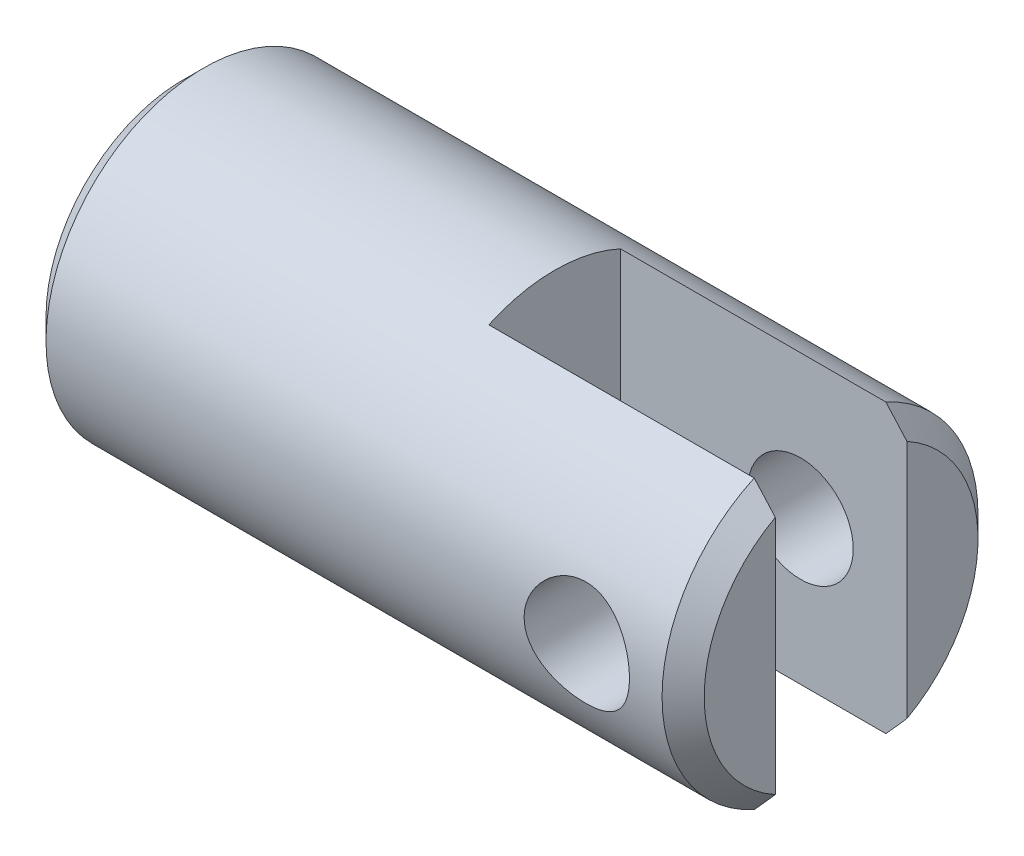
ISO-10303-21;
HEADER;
FILE_DESCRIPTION(('STEP AP214'),'2;1');
FILE_NAME('part.step','',(''),(''),'','','');
FILE_SCHEMA(('AUTOMOTIVE_DESIGN { 1 0 10303 214 1 1 1 1 }'));
ENDSEC;
DATA;
#1=APPLICATION_CONTEXT('core data for automotive mechanical design processes');
#2=APPLICATION_PROTOCOL_DEFINITION('international standard','automotive_design',2000,#1);
#3=PRODUCT_CONTEXT('',#1,'mechanical');
#4=PRODUCT('Part','Part','',(#3));
#5=PRODUCT_RELATED_PRODUCT_CATEGORY('part','',(#4));
#6=PRODUCT_DEFINITION_FORMATION('','',#4);
#7=PRODUCT_DEFINITION_CONTEXT('part definition',#1,'design');
#8=PRODUCT_DEFINITION('design','',#6,#7);
#9=PRODUCT_DEFINITION_SHAPE('','',#8);
#10=(LENGTH_UNIT() NAMED_UNIT(*) SI_UNIT(.MILLI.,.METRE.));
#11=(NAMED_UNIT(*) PLANE_ANGLE_UNIT() SI_UNIT($,.RADIAN.));
#12=(NAMED_UNIT(*) SI_UNIT($,.STERADIAN.) SOLID_ANGLE_UNIT());
#13=UNCERTAINTY_MEASURE_WITH_UNIT(LENGTH_MEASURE(1.E-05),#10,'distance_accuracy_value','');
#14=(GEOMETRIC_REPRESENTATION_CONTEXT(3) GLOBAL_UNCERTAINTY_ASSIGNED_CONTEXT((#13)) GLOBAL_UNIT_ASSIGNED_CONTEXT((#10,
#11,#12)) REPRESENTATION_CONTEXT('',''));
#15=CARTESIAN_POINT('',(0.,0.,0.));
#16=DIRECTION('',(0.,0.,1.));
#17=DIRECTION('',(1.,0.,0.));
#18=AXIS2_PLACEMENT_3D('',#15,#16,#17);
#19=CARTESIAN_POINT('',(39.6875,0.,0.));
#20=DIRECTION('',(1.,0.,0.));
#21=DIRECTION('',(0.,0.,-1.));
#22=AXIS2_PLACEMENT_3D('',#19,#20,#21);
#23=PLANE('',#22);
#24=DIRECTION('',(0.,1.,0.));
#25=VECTOR('',#24,1.);
#26=CARTESIAN_POINT('',(39.6875,-8.6587902409921,-3.96875));
#27=LINE('',#26,#25);
#28=CARTESIAN_POINT('',(39.6875,-7.238373328138,-3.96875));
#29=VERTEX_POINT('',#28);
#30=CARTESIAN_POINT('',(39.6875,7.238373328138,-3.96875));
#31=VERTEX_POINT('',#30);
#32=EDGE_CURVE('E114',#29,#31,#27,.T.);
#33=ORIENTED_EDGE('',*,*,#32,.F.);
#34=CARTESIAN_POINT('',(39.6875,0.,0.));
#35=DIRECTION('',(1.,0.,0.));
#36=DIRECTION('',(0.,0.,-1.));
#37=AXIS2_PLACEMENT_3D('',#34,#35,#36);
#38=CIRCLE('',#37,8.25499999999998);
#39=EDGE_CURVE('E212',#29,#31,#38,.T.);
#40=ORIENTED_EDGE('',*,*,#39,.T.);
#41=EDGE_LOOP('',(#33,#40));
#42=FACE_BOUND('',#41,.T.);
#43=ADVANCED_FACE('F34',(#42),#23,.T.);
#44=CARTESIAN_POINT('',(39.6875,0.,0.));
#45=DIRECTION('',(-1.,0.,0.));
#46=DIRECTION('',(0.,0.,1.));
#47=AXIS2_PLACEMENT_3D('',#44,#45,#46);
#48=CYLINDRICAL_SURFACE('',#47,9.525);
#49=CARTESIAN_POINT('',(1.27000000000001,0.,0.));
#50=DIRECTION('',(1.,0.,0.));
#51=DIRECTION('',(0.,0.,-1.));
#52=AXIS2_PLACEMENT_3D('',#49,#50,#51);
#53=CIRCLE('',#52,9.525);
#54=CARTESIAN_POINT('',(1.27000000000001,0.,-9.525));
#55=VERTEX_POINT('',#54);
#56=EDGE_CURVE('E134',#55,#55,#53,.T.);
#57=ORIENTED_EDGE('',*,*,#56,.T.);
#58=EDGE_LOOP('',(#57));
#59=FACE_BOUND('',#58,.T.);
#60=CARTESIAN_POINT('',(36.449,0.,-9.525));
#61=CARTESIAN_POINT('',(36.449000805598,0.173238677165346,-9.52500048580498));
#62=CARTESIAN_POINT('',(36.4347751550461,0.346472492659895,-9.52023018186455));
#63=CARTESIAN_POINT('',(36.3784225795053,0.687837590771685,-9.50167042395416));
#64=CARTESIAN_POINT('',(36.3362927579622,0.855968341777245,-9.48788003366834));
#65=CARTESIAN_POINT('',(36.2257364022556,1.18215660666814,-9.45277852602955));
#66=CARTESIAN_POINT('',(36.1573538266918,1.34023044718816,-9.43147998545459));
#67=CARTESIAN_POINT('',(35.9964317762382,1.6426654243569,-9.3835361515256));
#68=CARTESIAN_POINT('',(35.9038875361167,1.78702384834389,-9.35688980370195));
#69=CARTESIAN_POINT('',(35.6939030695735,2.06292981819569,-9.30002249856541));
#70=CARTESIAN_POINT('',(35.5757758312229,2.19393674844713,-9.26971591772517));
#71=CARTESIAN_POINT('',(35.3194392838066,2.43469379932912,-9.20941499436411));
#72=CARTESIAN_POINT('',(35.181225564102,2.54443923892904,-9.17942072197493));
#73=CARTESIAN_POINT('',(34.8837722592512,2.74264419157345,-9.12219830615344));
#74=CARTESIAN_POINT('',(34.7240423763505,2.83040092485178,-9.0950744970031));
#75=CARTESIAN_POINT('',(34.3910409000941,2.97757492456176,-9.04796594704059));
#76=CARTESIAN_POINT('',(34.2177734580083,3.03700083920298,-9.02797902810367));
#77=CARTESIAN_POINT('',(33.8687625217479,3.12379824029159,-8.99830887880273));
#78=CARTESIAN_POINT('',(33.6932993630472,3.15218269826286,-8.98830104068516));
#79=CARTESIAN_POINT('',(33.3398375805551,3.17925806658696,-8.97876209798686));
#80=CARTESIAN_POINT('',(33.1618397572483,3.17795815259498,-8.97922775597168));
#81=CARTESIAN_POINT('',(32.8170011983402,3.14648819425835,-8.99029872650972));
#82=CARTESIAN_POINT('',(32.6500223207321,3.1176401743052,-9.00043970379417));
#83=CARTESIAN_POINT('',(32.3234258927483,3.03404956704689,-9.02895888275449));
#84=CARTESIAN_POINT('',(32.1638092262436,2.97930387942919,-9.04733807064542));
#85=CARTESIAN_POINT('',(31.853464520047,2.84460650934116,-9.09059367841715));
#86=CARTESIAN_POINT('',(31.7029210191343,2.76426310464555,-9.11556996393148));
#87=CARTESIAN_POINT('',(31.4170348662119,2.58092291251246,-9.16916373477931));
#88=CARTESIAN_POINT('',(31.2816966219865,2.47791958175572,-9.19778227084722));
#89=CARTESIAN_POINT('',(31.0226341758395,2.2458341312661,-9.25726270107577));
#90=CARTESIAN_POINT('',(30.8998851949337,2.11567125149229,-9.28816371201626));
#91=CARTESIAN_POINT('',(30.6777032283437,1.83622813465495,-9.34742029378842));
#92=CARTESIAN_POINT('',(30.5782724788277,1.68694606622309,-9.37577562033364));
#93=CARTESIAN_POINT('',(30.4047642467537,1.3714336714219,-9.42711817702495));
#94=CARTESIAN_POINT('',(30.3309480649932,1.20504990262187,-9.45004936275525));
#95=CARTESIAN_POINT('',(30.2126549226906,0.861279339682312,-9.4875530068358));
#96=CARTESIAN_POINT('',(30.1681677705306,0.683896391141978,-9.50212836854242));
#97=CARTESIAN_POINT('',(30.111523260379,0.331418658755541,-9.52079715951823));
#98=CARTESIAN_POINT('',(30.0980481058765,0.156557979570887,-9.52531755822087));
#99=CARTESIAN_POINT('',(30.1000562386751,-0.192960847123753,-9.52464766056077));
#100=CARTESIAN_POINT('',(30.1155346379361,-0.367619023839889,-9.51945900331475));
#101=CARTESIAN_POINT('',(30.1739678070617,-0.706500575516011,-9.50023578476806));
#102=CARTESIAN_POINT('',(30.2161137042071,-0.870879661700629,-9.48646180908036));
#103=CARTESIAN_POINT('',(30.3256741861819,-1.19016766849015,-9.45171613685472));
#104=CARTESIAN_POINT('',(30.3930919933102,-1.34507537851482,-9.43074352248193));
#105=CARTESIAN_POINT('',(30.5532486210945,-1.64556534104864,-9.38304356837145));
#106=CARTESIAN_POINT('',(30.6466068336741,-1.79079512051444,-9.35617936849621));
#107=CARTESIAN_POINT('',(30.8552664262928,-2.06395583568048,-9.29974181184133));
#108=CARTESIAN_POINT('',(30.9705745079009,-2.19188146775095,-9.27016762910402));
#109=CARTESIAN_POINT('',(31.2260575344459,-2.432851712285,-9.20993992337912));
#110=CARTESIAN_POINT('',(31.3671242954928,-2.54495607735532,-9.17929841452584));
#111=CARTESIAN_POINT('',(31.6667247277996,-2.74401763337735,-9.121774152107));
#112=CARTESIAN_POINT('',(31.8252585446632,-2.83097461468096,-9.09489142987857));
#113=CARTESIAN_POINT('',(32.1553618235454,-2.97687025407194,-9.04819093937643));
#114=CARTESIAN_POINT('',(32.3269041013608,-3.03586556962394,-9.02835890517708));
#115=CARTESIAN_POINT('',(32.6783022138901,-3.12386556696095,-8.99829392572977));
#116=CARTESIAN_POINT('',(32.8581542651588,-3.15288375947876,-8.98805665630055));
#117=CARTESIAN_POINT('',(33.2111257799299,-3.17905219686556,-8.97883201925513));
#118=CARTESIAN_POINT('',(33.3841164304107,-3.17776306695416,-8.97929370817293));
#119=CARTESIAN_POINT('',(33.7272791128775,-3.1471942816996,-8.99005281690779));
#120=CARTESIAN_POINT('',(33.8974513120074,-3.11791629228101,-9.00034965132723));
#121=CARTESIAN_POINT('',(34.2269307300328,-3.03330550668567,-9.02920864668031));
#122=CARTESIAN_POINT('',(34.3863829193893,-2.97847812359925,-9.04761011221366));
#123=CARTESIAN_POINT('',(34.693947017029,-2.84473448628719,-9.09054566248638));
#124=CARTESIAN_POINT('',(34.8420563990219,-2.76581288515833,-9.11508110823773));
#125=CARTESIAN_POINT('',(35.1297356520052,-2.58210269895239,-9.16885482792697));
#126=CARTESIAN_POINT('',(35.2686508935274,-2.47633567077755,-9.19825159463785));
#127=CARTESIAN_POINT('',(35.5272651574948,-2.24359115395569,-9.25777156199328));
#128=CARTESIAN_POINT('',(35.6469587278096,-2.11660766813346,-9.28789496596782));
#129=CARTESIAN_POINT('',(35.8684335090181,-1.83909194322319,-9.34688346918603));
#130=CARTESIAN_POINT('',(35.9693348041094,-1.68783480536164,-9.3756537721899));
#131=CARTESIAN_POINT('',(36.1441696116008,-1.36955960976603,-9.42740021973043));
#132=CARTESIAN_POINT('',(36.2181100183025,-1.2025455950702,-9.45037784507677));
#133=CARTESIAN_POINT('',(36.3338161831515,-0.865167329863096,-9.4870751034262));
#134=CARTESIAN_POINT('',(36.3768718303862,-0.695286130622597,-9.50116249441509));
#135=CARTESIAN_POINT('',(36.4344593911499,-0.350267320832535,-9.52012342428904));
#136=CARTESIAN_POINT('',(36.4489991856015,-0.17513117618077,-9.52499950888798));
#137=CARTESIAN_POINT('',(36.449,0.,-9.525));
#138=B_SPLINE_CURVE_WITH_KNOTS('',3,(#60,#61,#62,#63,#64,#65,#66,#67,#68,#69,#70,#71,#72,#73,
#74,#75,#76,#77,#78,#79,#80,#81,#82,#83,#84,#85,#86,#87,#88,#89,#90,#91,#92,#93,#94,#95,#96,#97,
#98,#99,#100,#101,#102,#103,#104,#105,#106,#107,#108,#109,#110,#111,#112,#113,#114,#115,#116,
#117,#118,#119,#120,#121,#122,#123,#124,#125,#126,#127,#128,#129,#130,#131,#132,#133,#134,#135,
#136,#137),.UNSPECIFIED.,.T.,.F.,(4,2,2,2,2,2,2,2,2,2,2,2,2,2,2,2,2,2,2,2,2,2,2,2,2,2,2,2,2,2,2,
2,2,2,2,2,2,2,4),(0.,0.519071561632583,1.03819701322438,1.55645698636311,2.07481924951214,
2.6093637259775,3.14402575687909,3.69406121814519,4.24392866899746,4.77526114230341,
5.30642937910266,5.81332424300315,6.32027980466156,6.8353994341754,7.35066800622307,
7.89283745951089,8.43505888444012,8.98265937939884,9.53006948685135,10.0537512658116,
10.5773446429626,11.0857715158083,11.5942632377703,12.1161301950386,12.638156741095,
13.1839024764639,13.7296527614611,14.2742924389999,14.8186865394104,15.3351123975402,
15.8515075194062,16.3580948898032,16.8647947620873,17.3936046174648,17.92256420318,
18.4721392315144,19.0215736265905,19.5464607283686,20.0712027467109),.UNSPECIFIED.);
#139=CARTESIAN_POINT('',(36.449,0.,-9.525));
#140=VERTEX_POINT('',#139);
#141=EDGE_CURVE('E188',#140,#140,#138,.T.);
#142=ORIENTED_EDGE('',*,*,#141,.T.);
#143=EDGE_LOOP('',(#142));
#144=FACE_BOUND('',#143,.T.);
#145=CARTESIAN_POINT('',(36.449,0.,9.52499999999999));
#146=CARTESIAN_POINT('',(36.449000805598,-0.173238677165346,9.52500048580497));
#147=CARTESIAN_POINT('',(36.4347751550461,-0.346472492659896,9.52023018186455));
#148=CARTESIAN_POINT('',(36.3784225795053,-0.687837590771687,9.50167042395417));
#149=CARTESIAN_POINT('',(36.3362927579622,-0.855968341777246,9.48788003366834));
#150=CARTESIAN_POINT('',(36.2257364022556,-1.18215660666814,9.45277852602955));
#151=CARTESIAN_POINT('',(36.1573538266918,-1.34023044718816,9.43147998545459));
#152=CARTESIAN_POINT('',(35.9964317762382,-1.64266542435691,9.3835361515256));
#153=CARTESIAN_POINT('',(35.9038875361167,-1.78702384834389,9.35688980370195));
#154=CARTESIAN_POINT('',(35.6939030695735,-2.0629298181957,9.30002249856541));
#155=CARTESIAN_POINT('',(35.5757758312229,-2.19393674844713,9.26971591772517));
#156=CARTESIAN_POINT('',(35.3194392838066,-2.43469379932912,9.20941499436411));
#157=CARTESIAN_POINT('',(35.181225564102,-2.54443923892904,9.17942072197493));
#158=CARTESIAN_POINT('',(34.8837722592512,-2.74264419157345,9.12219830615344));
#159=CARTESIAN_POINT('',(34.7240423763505,-2.83040092485178,9.0950744970031));
#160=CARTESIAN_POINT('',(34.3910409000941,-2.97757492456176,9.04796594704059));
#161=CARTESIAN_POINT('',(34.2177734580083,-3.03700083920298,9.02797902810367));
#162=CARTESIAN_POINT('',(33.8687625217479,-3.12379824029159,8.99830887880273));
#163=CARTESIAN_POINT('',(33.6932993630472,-3.15218269826286,8.98830104068516));
#164=CARTESIAN_POINT('',(33.3398375805551,-3.17925806658696,8.97876209798686));
#165=CARTESIAN_POINT('',(33.1618397572483,-3.17795815259498,8.97922775597168));
#166=CARTESIAN_POINT('',(32.8170011983402,-3.14648819425835,8.99029872650972));
#167=CARTESIAN_POINT('',(32.6500223207321,-3.1176401743052,9.00043970379417));
#168=CARTESIAN_POINT('',(32.3234258927483,-3.03404956704689,9.02895888275449));
#169=CARTESIAN_POINT('',(32.1638092262436,-2.97930387942919,9.04733807064542));
#170=CARTESIAN_POINT('',(31.853464520047,-2.84460650934116,9.09059367841715));
#171=CARTESIAN_POINT('',(31.7029210191343,-2.76426310464555,9.11556996393148));
#172=CARTESIAN_POINT('',(31.4170348662119,-2.58092291251246,9.16916373477932));
#173=CARTESIAN_POINT('',(31.2816966219865,-2.47791958175571,9.19778227084722));
#174=CARTESIAN_POINT('',(31.0226341758395,-2.2458341312661,9.25726270107577));
#175=CARTESIAN_POINT('',(30.8998851949337,-2.11567125149229,9.28816371201626));
#176=CARTESIAN_POINT('',(30.6777032283437,-1.83622813465495,9.34742029378842));
#177=CARTESIAN_POINT('',(30.5782724788277,-1.68694606622308,9.37577562033364));
#178=CARTESIAN_POINT('',(30.4047642467537,-1.3714336714219,9.42711817702495));
#179=CARTESIAN_POINT('',(30.3309480649932,-1.20504990262187,9.45004936275525));
#180=CARTESIAN_POINT('',(30.2126549226906,-0.861279339682311,9.4875530068358));
#181=CARTESIAN_POINT('',(30.1681677705306,-0.683896391141977,9.50212836854242));
#182=CARTESIAN_POINT('',(30.111523260379,-0.331418658755539,9.52079715951823));
#183=CARTESIAN_POINT('',(30.0980481058765,-0.156557979570885,9.52531755822087));
#184=CARTESIAN_POINT('',(30.1000562386751,0.192960847123755,9.52464766056077));
#185=CARTESIAN_POINT('',(30.1155346379361,0.367619023839891,9.51945900331475));
#186=CARTESIAN_POINT('',(30.1739678070617,0.706500575516013,9.50023578476806));
#187=CARTESIAN_POINT('',(30.2161137042071,0.87087966170063,9.48646180908036));
#188=CARTESIAN_POINT('',(30.3256741861819,1.19016766849015,9.45171613685472));
#189=CARTESIAN_POINT('',(30.3930919933102,1.34507537851483,9.43074352248193));
#190=CARTESIAN_POINT('',(30.5532486210945,1.64556534104864,9.38304356837145));
#191=CARTESIAN_POINT('',(30.6466068336741,1.79079512051444,9.35617936849621));
#192=CARTESIAN_POINT('',(30.8552664262928,2.06395583568049,9.29974181184133));
#193=CARTESIAN_POINT('',(30.9705745079009,2.19188146775096,9.27016762910402));
#194=CARTESIAN_POINT('',(31.2260575344459,2.432851712285,9.20993992337912));
#195=CARTESIAN_POINT('',(31.3671242954928,2.54495607735532,9.17929841452584));
#196=CARTESIAN_POINT('',(31.6667247277996,2.74401763337735,9.121774152107));
#197=CARTESIAN_POINT('',(31.8252585446632,2.83097461468096,9.09489142987857));
#198=CARTESIAN_POINT('',(32.1553618235454,2.97687025407194,9.04819093937643));
#199=CARTESIAN_POINT('',(32.3269041013608,3.03586556962394,9.02835890517708));
#200=CARTESIAN_POINT('',(32.6783022138901,3.12386556696095,8.99829392572977));
#201=CARTESIAN_POINT('',(32.8581542651588,3.15288375947876,8.98805665630055));
#202=CARTESIAN_POINT('',(33.2111257799299,3.17905219686556,8.97883201925513));
#203=CARTESIAN_POINT('',(33.3841164304107,3.17776306695416,8.97929370817293));
#204=CARTESIAN_POINT('',(33.7272791128775,3.1471942816996,8.99005281690779));
#205=CARTESIAN_POINT('',(33.8974513120074,3.11791629228101,9.00034965132723));
#206=CARTESIAN_POINT('',(34.2269307300328,3.03330550668567,9.02920864668031));
#207=CARTESIAN_POINT('',(34.3863829193893,2.97847812359925,9.04761011221366));
#208=CARTESIAN_POINT('',(34.693947017029,2.84473448628719,9.09054566248638));
#209=CARTESIAN_POINT('',(34.8420563990219,2.76581288515833,9.11508110823773));
#210=CARTESIAN_POINT('',(35.1297356520052,2.58210269895239,9.16885482792697));
#211=CARTESIAN_POINT('',(35.2686508935274,2.47633567077754,9.19825159463785));
#212=CARTESIAN_POINT('',(35.5272651574948,2.24359115395568,9.25777156199328));
#213=CARTESIAN_POINT('',(35.6469587278096,2.11660766813345,9.28789496596782));
#214=CARTESIAN_POINT('',(35.8684335090181,1.83909194322319,9.34688346918603));
#215=CARTESIAN_POINT('',(35.9693348041094,1.68783480536164,9.3756537721899));
#216=CARTESIAN_POINT('',(36.1441696116008,1.36955960976603,9.42740021973043));
#217=CARTESIAN_POINT('',(36.2181100183025,1.2025455950702,9.45037784507677));
#218=CARTESIAN_POINT('',(36.3338161831515,0.865167329863095,9.48707510342621));
#219=CARTESIAN_POINT('',(36.3768718303862,0.695286130622595,9.5011624944151));
#220=CARTESIAN_POINT('',(36.4344593911499,0.350267320832533,9.52012342428904));
#221=CARTESIAN_POINT('',(36.4489991856015,0.175131176180769,9.52499950888797));
#222=CARTESIAN_POINT('',(36.449,0.,9.52499999999999));
#223=B_SPLINE_CURVE_WITH_KNOTS('',3,(#145,#146,#147,#148,#149,#150,#151,#152,#153,#154,#155,
#156,#157,#158,#159,#160,#161,#162,#163,#164,#165,#166,#167,#168,#169,#170,#171,#172,#173,#174,
#175,#176,#177,#178,#179,#180,#181,#182,#183,#184,#185,#186,#187,#188,#189,#190,#191,#192,#193,
#194,#195,#196,#197,#198,#199,#200,#201,#202,#203,#204,#205,#206,#207,#208,#209,#210,#211,#212,
#213,#214,#215,#216,#217,#218,#219,#220,#221,#222),.UNSPECIFIED.,.T.,.F.,(4,2,2,2,2,2,2,2,2,2,2,
2,2,2,2,2,2,2,2,2,2,2,2,2,2,2,2,2,2,2,2,2,2,2,2,2,2,2,4),(0.,0.519071561632585,1.03819701322438,
1.55645698636312,2.07481924951214,2.6093637259775,3.14402575687909,3.69406121814519,
4.24392866899746,4.77526114230341,5.30642937910266,5.81332424300315,6.32027980466156,
6.8353994341754,7.35066800622308,7.8928374595109,8.43505888444012,8.98265937939884,
9.53006948685135,10.0537512658116,10.5773446429626,11.0857715158083,11.5942632377703,
12.1161301950386,12.638156741095,13.1839024764639,13.7296527614611,14.2742924389999,
14.8186865394104,15.3351123975402,15.8515075194062,16.3580948898032,16.8647947620873,
17.3936046174648,17.92256420318,18.4721392315144,19.0215736265905,19.5464607283686,
20.0712027467109),.UNSPECIFIED.);
#224=CARTESIAN_POINT('',(36.449,0.,9.52499999999999));
#225=VERTEX_POINT('',#224);
#226=EDGE_CURVE('E181',#225,#225,#223,.T.);
#227=ORIENTED_EDGE('',*,*,#226,.T.);
#228=EDGE_LOOP('',(#227));
#229=FACE_BOUND('',#228,.T.);
#230=DIRECTION('',(1.,0.,0.));
#231=VECTOR('',#230,1.);
#232=CARTESIAN_POINT('',(22.4155,-8.6587902409921,3.96875));
#233=LINE('',#232,#231);
#234=CARTESIAN_POINT('',(22.4155,-8.6587902409921,3.96875));
#235=VERTEX_POINT('',#234);
#236=CARTESIAN_POINT('',(38.4175,-8.6587902409921,3.96875));
#237=VERTEX_POINT('',#236);
#238=EDGE_CURVE('E101',#235,#237,#233,.T.);
#239=ORIENTED_EDGE('',*,*,#238,.T.);
#240=CARTESIAN_POINT('',(38.4175,0.,0.));
#241=DIRECTION('',(1.,0.,0.));
#242=DIRECTION('',(0.,0.,-1.));
#243=AXIS2_PLACEMENT_3D('',#240,#241,#242);
#244=CIRCLE('',#243,9.525);
#245=CARTESIAN_POINT('',(38.4175,8.6587902409921,3.96875));
#246=VERTEX_POINT('',#245);
#247=EDGE_CURVE('E118',#237,#246,#244,.F.);
#248=ORIENTED_EDGE('',*,*,#247,.T.);
#249=DIRECTION('',(1.,0.,0.));
#250=VECTOR('',#249,1.);
#251=CARTESIAN_POINT('',(22.4155,8.6587902409921,3.96875));
#252=LINE('',#251,#250);
#253=CARTESIAN_POINT('',(22.4155,8.6587902409921,3.96875));
#254=VERTEX_POINT('',#253);
#255=EDGE_CURVE('E98',#254,#246,#252,.T.);
#256=ORIENTED_EDGE('',*,*,#255,.F.);
#257=CARTESIAN_POINT('',(22.4155,0.,0.));
#258=DIRECTION('',(1.,0.,0.));
#259=DIRECTION('',(0.,0.,-1.));
#260=AXIS2_PLACEMENT_3D('',#257,#258,#259);
#261=CIRCLE('',#260,9.525);
#262=CARTESIAN_POINT('',(22.4155,8.6587902409921,-3.96875));
#263=VERTEX_POINT('',#262);
#264=EDGE_CURVE('E105',#263,#254,#261,.T.);
#265=ORIENTED_EDGE('',*,*,#264,.F.);
#266=DIRECTION('',(1.,0.,0.));
#267=VECTOR('',#266,1.);
#268=CARTESIAN_POINT('',(22.4155,8.6587902409921,-3.96875));
#269=LINE('',#268,#267);
#270=CARTESIAN_POINT('',(38.4175,8.6587902409921,-3.96875));
#271=VERTEX_POINT('',#270);
#272=EDGE_CURVE('E132',#263,#271,#269,.T.);
#273=ORIENTED_EDGE('',*,*,#272,.T.);
#274=CARTESIAN_POINT('',(38.4175,0.,0.));
#275=DIRECTION('',(1.,0.,0.));
#276=DIRECTION('',(0.,0.,-1.));
#277=AXIS2_PLACEMENT_3D('',#274,#275,#276);
#278=CIRCLE('',#277,9.525);
#279=CARTESIAN_POINT('',(38.4175,-8.6587902409921,-3.96875));
#280=VERTEX_POINT('',#279);
#281=EDGE_CURVE('E130',#271,#280,#278,.F.);
#282=ORIENTED_EDGE('',*,*,#281,.T.);
#283=DIRECTION('',(1.,0.,0.));
#284=VECTOR('',#283,1.);
#285=CARTESIAN_POINT('',(22.4155,-8.6587902409921,-3.96875));
#286=LINE('',#285,#284);
#287=CARTESIAN_POINT('',(22.4155,-8.6587902409921,-3.96875));
#288=VERTEX_POINT('',#287);
#289=EDGE_CURVE('E120',#288,#280,#286,.T.);
#290=ORIENTED_EDGE('',*,*,#289,.F.);
#291=CARTESIAN_POINT('',(22.4155,0.,0.));
#292=DIRECTION('',(1.,0.,0.));
#293=DIRECTION('',(0.,0.,-1.));
#294=AXIS2_PLACEMENT_3D('',#291,#292,#293);
#295=CIRCLE('',#294,9.525);
#296=EDGE_CURVE('E104',#235,#288,#295,.T.);
#297=ORIENTED_EDGE('',*,*,#296,.F.);
#298=EDGE_LOOP('',(#239,#248,#256,#265,#273,#282,#290,#297));
#299=FACE_BOUND('',#298,.T.);
#300=ADVANCED_FACE('F116',(#59,#144,#229,#299),#48,.T.);
#301=DIRECTION('',(0.,-1.,0.));
#302=VECTOR('',#301,1.);
#303=CARTESIAN_POINT('',(39.6875,8.6587902409921,3.96875));
#304=LINE('',#303,#302);
#305=CARTESIAN_POINT('',(39.6875,7.238373328138,3.96875));
#306=VERTEX_POINT('',#305);
#307=CARTESIAN_POINT('',(39.6875,-7.238373328138,3.96875));
#308=VERTEX_POINT('',#307);
#309=EDGE_CURVE('E193',#306,#308,#304,.T.);
#310=ORIENTED_EDGE('',*,*,#309,.F.);
#311=CARTESIAN_POINT('',(39.6875,0.,0.));
#312=DIRECTION('',(1.,0.,0.));
#313=DIRECTION('',(0.,0.,-1.));
#314=AXIS2_PLACEMENT_3D('',#311,#312,#313);
#315=CIRCLE('',#314,8.25499999999998);
#316=EDGE_CURVE('E140',#306,#308,#315,.T.);
#317=ORIENTED_EDGE('',*,*,#316,.T.);
#318=EDGE_LOOP('',(#310,#317));
#319=FACE_BOUND('',#318,.T.);
#320=ADVANCED_FACE('F166',(#319),#23,.T.);
#321=CARTESIAN_POINT('',(0.,0.,0.));
#322=DIRECTION('',(1.,0.,0.));
#323=DIRECTION('',(0.,0.,-1.));
#324=AXIS2_PLACEMENT_3D('',#321,#322,#323);
#325=PLANE('',#324);
#326=CARTESIAN_POINT('',(0.,0.,0.));
#327=DIRECTION('',(-1.,0.,0.));
#328=DIRECTION('',(0.,0.,1.));
#329=AXIS2_PLACEMENT_3D('',#326,#327,#328);
#330=CIRCLE('',#329,3.175);
#331=CARTESIAN_POINT('',(0.,0.,3.175));
#332=VERTEX_POINT('',#331);
#333=EDGE_CURVE('E233',#332,#332,#330,.T.);
#334=ORIENTED_EDGE('',*,*,#333,.F.);
#335=EDGE_LOOP('',(#334));
#336=FACE_BOUND('',#335,.T.);
#337=CARTESIAN_POINT('',(0.,0.,0.));
#338=DIRECTION('',(1.,0.,0.));
#339=DIRECTION('',(0.,0.,-1.));
#340=AXIS2_PLACEMENT_3D('',#337,#338,#339);
#341=CIRCLE('',#340,8.25499999999998);
#342=CARTESIAN_POINT('',(0.,0.,-8.25499999999998));
#343=VERTEX_POINT('',#342);
#344=EDGE_CURVE('E137',#343,#343,#341,.F.);
#345=ORIENTED_EDGE('',*,*,#344,.T.);
#346=EDGE_LOOP('',(#345));
#347=FACE_BOUND('',#346,.T.);
#348=ADVANCED_FACE('F170',(#336,#347),#325,.F.);
#349=CARTESIAN_POINT('',(22.4155,-8.6587902409921,-3.96875));
#350=DIRECTION('',(0.,0.,-1.));
#351=DIRECTION('',(-1.,0.,0.));
#352=AXIS2_PLACEMENT_3D('',#349,#350,#351);
#353=PLANE('',#352);
#354=CARTESIAN_POINT('',(33.274,0.,-3.96875));
#355=DIRECTION('',(0.,0.,-1.));
#356=DIRECTION('',(-1.,0.,0.));
#357=AXIS2_PLACEMENT_3D('',#354,#355,#356);
#358=CIRCLE('',#357,3.175);
#359=CARTESIAN_POINT('',(30.099,0.,-3.96875));
#360=VERTEX_POINT('',#359);
#361=EDGE_CURVE('E128',#360,#360,#358,.T.);
#362=ORIENTED_EDGE('',*,*,#361,.T.);
#363=EDGE_LOOP('',(#362));
#364=FACE_BOUND('',#363,.T.);
#365=ORIENTED_EDGE('',*,*,#32,.T.);
#366=CARTESIAN_POINT('',(39.6875,7.238373328138,-3.96875));
#367=CARTESIAN_POINT('',(39.582811591401,7.35776096709702,-3.96875));
#368=CARTESIAN_POINT('',(39.4777893200169,7.47685515838941,-3.96875));
#369=CARTESIAN_POINT('',(39.2671521128822,7.71451414919927,-3.96875));
#370=CARTESIAN_POINT('',(39.1615371889559,7.83307895919474,-3.96875));
#371=CARTESIAN_POINT('',(38.9497859943266,8.06974095851595,-3.96875));
#372=CARTESIAN_POINT('',(38.8436497257174,8.18783814971643,-3.96875));
#373=CARTESIAN_POINT('',(38.6309102830091,8.42361556230968,-3.96875));
#374=CARTESIAN_POINT('',(38.5243070996771,8.54129577537304,-3.96875));
#375=CARTESIAN_POINT('',(38.4175,8.6587902409921,-3.96875));
#376=B_SPLINE_CURVE_WITH_KNOTS('',3,(#366,#367,#368,#369,#370,#371,#372,#373,#374,#375),
.UNSPECIFIED.,.F.,.F.,(4,2,2,2,4),(0.,0.476357362425002,0.952705254187973,1.42905123428182,
1.90540667664287),.UNSPECIFIED.);
#377=EDGE_CURVE('E11',#31,#271,#376,.T.);
#378=ORIENTED_EDGE('',*,*,#377,.T.);
#379=ORIENTED_EDGE('',*,*,#272,.F.);
#380=DIRECTION('',(0.,1.,0.));
#381=VECTOR('',#380,1.);
#382=CARTESIAN_POINT('',(22.4155,-8.6587902409921,-3.96875));
#383=LINE('',#382,#381);
#384=EDGE_CURVE('E111',#288,#263,#383,.T.);
#385=ORIENTED_EDGE('',*,*,#384,.F.);
#386=ORIENTED_EDGE('',*,*,#289,.T.);
#387=CARTESIAN_POINT('',(38.4175,-8.6587902409921,-3.96875));
#388=CARTESIAN_POINT('',(38.5243070996771,-8.54129577537304,-3.96875));
#389=CARTESIAN_POINT('',(38.6309102830091,-8.42361556230968,-3.96875));
#390=CARTESIAN_POINT('',(38.8436497257174,-8.18783814971643,-3.96875));
#391=CARTESIAN_POINT('',(38.9497859943266,-8.06974095851595,-3.96875));
#392=CARTESIAN_POINT('',(39.1615371889559,-7.83307895919474,-3.96875));
#393=CARTESIAN_POINT('',(39.2671521128822,-7.71451414919927,-3.96875));
#394=CARTESIAN_POINT('',(39.4777893200169,-7.47685515838941,-3.96875));
#395=CARTESIAN_POINT('',(39.582811591401,-7.35776096709702,-3.96875));
#396=CARTESIAN_POINT('',(39.6875,-7.23837332813801,-3.96875));
#397=B_SPLINE_CURVE_WITH_KNOTS('',3,(#387,#388,#389,#390,#391,#392,#393,#394,#395,#396),
.UNSPECIFIED.,.F.,.F.,(4,2,2,2,4),(0.,0.476355442361045,0.952701422454901,1.42904931421787,
1.90540667664288),.UNSPECIFIED.);
#398=EDGE_CURVE('E48',#280,#29,#397,.T.);
#399=ORIENTED_EDGE('',*,*,#398,.T.);
#400=EDGE_LOOP('',(#365,#378,#379,#385,#386,#399));
#401=FACE_BOUND('',#400,.T.);
#402=ADVANCED_FACE('F162',(#364,#401),#353,.F.);
#403=CARTESIAN_POINT('',(22.4155,8.6587902409921,3.96875));
#404=DIRECTION('',(0.,0.,1.));
#405=DIRECTION('',(1.,0.,0.));
#406=AXIS2_PLACEMENT_3D('',#403,#404,#405);
#407=PLANE('',#406);
#408=CARTESIAN_POINT('',(33.274,0.,3.96875));
#409=DIRECTION('',(0.,0.,1.));
#410=DIRECTION('',(1.,0.,0.));
#411=AXIS2_PLACEMENT_3D('',#408,#409,#410);
#412=CIRCLE('',#411,3.175);
#413=CARTESIAN_POINT('',(36.449,0.,3.96875));
#414=VERTEX_POINT('',#413);
#415=EDGE_CURVE('E125',#414,#414,#412,.T.);
#416=ORIENTED_EDGE('',*,*,#415,.T.);
#417=EDGE_LOOP('',(#416));
#418=FACE_BOUND('',#417,.T.);
#419=ORIENTED_EDGE('',*,*,#309,.T.);
#420=CARTESIAN_POINT('',(39.6875,-7.238373328138,3.96875));
#421=CARTESIAN_POINT('',(39.582811591401,-7.35776096709702,3.96875));
#422=CARTESIAN_POINT('',(39.4777893200169,-7.47685515838941,3.96875));
#423=CARTESIAN_POINT('',(39.2671521128822,-7.71451414919927,3.96875));
#424=CARTESIAN_POINT('',(39.1615371889559,-7.83307895919474,3.96875));
#425=CARTESIAN_POINT('',(38.9497859943266,-8.06974095851595,3.96875));
#426=CARTESIAN_POINT('',(38.8436497257174,-8.18783814971643,3.96875));
#427=CARTESIAN_POINT('',(38.6309102830091,-8.42361556230968,3.96875));
#428=CARTESIAN_POINT('',(38.5243070996771,-8.54129577537304,3.96875));
#429=CARTESIAN_POINT('',(38.4175,-8.6587902409921,3.96875));
#430=B_SPLINE_CURVE_WITH_KNOTS('',3,(#420,#421,#422,#423,#424,#425,#426,#427,#428,#429),
.UNSPECIFIED.,.F.,.F.,(4,2,2,2,4),(0.,0.476357362425002,0.952705254187973,1.42905123428182,
1.90540667664287),.UNSPECIFIED.);
#431=EDGE_CURVE('E150',#308,#237,#430,.T.);
#432=ORIENTED_EDGE('',*,*,#431,.T.);
#433=ORIENTED_EDGE('',*,*,#238,.F.);
#434=DIRECTION('',(0.,-1.,0.));
#435=VECTOR('',#434,1.);
#436=CARTESIAN_POINT('',(22.4155,8.6587902409921,3.96875));
#437=LINE('',#436,#435);
#438=EDGE_CURVE('E93',#254,#235,#437,.T.);
#439=ORIENTED_EDGE('',*,*,#438,.F.);
#440=ORIENTED_EDGE('',*,*,#255,.T.);
#441=CARTESIAN_POINT('',(38.4175,8.6587902409921,3.96875));
#442=CARTESIAN_POINT('',(38.5243070996771,8.54129577537304,3.96875));
#443=CARTESIAN_POINT('',(38.6309102830091,8.42361556230968,3.96875));
#444=CARTESIAN_POINT('',(38.8436497257174,8.18783814971643,3.96875));
#445=CARTESIAN_POINT('',(38.9497859943266,8.06974095851595,3.96875));
#446=CARTESIAN_POINT('',(39.1615371889559,7.83307895919474,3.96875));
#447=CARTESIAN_POINT('',(39.2671521128822,7.71451414919927,3.96875));
#448=CARTESIAN_POINT('',(39.4777893200169,7.47685515838941,3.96875));
#449=CARTESIAN_POINT('',(39.582811591401,7.35776096709702,3.96875));
#450=CARTESIAN_POINT('',(39.6875,7.23837332813801,3.96875));
#451=B_SPLINE_CURVE_WITH_KNOTS('',3,(#441,#442,#443,#444,#445,#446,#447,#448,#449,#450),
.UNSPECIFIED.,.F.,.F.,(4,2,2,2,4),(0.,0.476355442361045,0.952701422454901,1.42904931421787,
1.90540667664288),.UNSPECIFIED.);
#452=EDGE_CURVE('E143',#246,#306,#451,.T.);
#453=ORIENTED_EDGE('',*,*,#452,.T.);
#454=EDGE_LOOP('',(#419,#432,#433,#439,#440,#453));
#455=FACE_BOUND('',#454,.T.);
#456=ADVANCED_FACE('F96',(#418,#455),#407,.F.);
#457=CARTESIAN_POINT('',(22.4155,0.,0.));
#458=DIRECTION('',(1.,0.,0.));
#459=DIRECTION('',(0.,0.,-1.));
#460=AXIS2_PLACEMENT_3D('',#457,#458,#459);
#461=PLANE('',#460);
#462=ORIENTED_EDGE('',*,*,#264,.T.);
#463=ORIENTED_EDGE('',*,*,#438,.T.);
#464=ORIENTED_EDGE('',*,*,#296,.T.);
#465=ORIENTED_EDGE('',*,*,#384,.T.);
#466=EDGE_LOOP('',(#462,#463,#464,#465));
#467=FACE_BOUND('',#466,.T.);
#468=ADVANCED_FACE('F109',(#467),#461,.T.);
#469=CARTESIAN_POINT('',(33.274,0.,-9.525));
#470=DIRECTION('',(0.,0.,1.));
#471=DIRECTION('',(1.,0.,0.));
#472=AXIS2_PLACEMENT_3D('',#469,#470,#471);
#473=CYLINDRICAL_SURFACE('',#472,3.175);
#474=ORIENTED_EDGE('',*,*,#415,.F.);
#475=EDGE_LOOP('',(#474));
#476=FACE_BOUND('',#475,.T.);
#477=ORIENTED_EDGE('',*,*,#226,.F.);
#478=EDGE_LOOP('',(#477));
#479=FACE_BOUND('',#478,.T.);
#480=ADVANCED_FACE('F198',(#476,#479),#473,.F.);
#481=ORIENTED_EDGE('',*,*,#361,.F.);
#482=EDGE_LOOP('',(#481));
#483=FACE_BOUND('',#482,.T.);
#484=ORIENTED_EDGE('',*,*,#141,.F.);
#485=EDGE_LOOP('',(#484));
#486=FACE_BOUND('',#485,.T.);
#487=ADVANCED_FACE('F194',(#483,#486),#473,.F.);
#488=CARTESIAN_POINT('',(1.27000000000001,0.,0.));
#489=DIRECTION('',(1.,0.,0.));
#490=DIRECTION('',(0.,0.,-1.));
#491=AXIS2_PLACEMENT_3D('',#488,#489,#490);
#492=CONICAL_SURFACE('',#491,9.525,0.785398163397454);
#493=ORIENTED_EDGE('',*,*,#344,.F.);
#494=EDGE_LOOP('',(#493));
#495=FACE_BOUND('',#494,.T.);
#496=ORIENTED_EDGE('',*,*,#56,.F.);
#497=EDGE_LOOP('',(#496));
#498=FACE_BOUND('',#497,.T.);
#499=ADVANCED_FACE('F178',(#495,#498),#492,.T.);
#500=CARTESIAN_POINT('',(39.6875,0.,0.));
#501=DIRECTION('',(-1.,0.,0.));
#502=DIRECTION('',(0.,0.,1.));
#503=AXIS2_PLACEMENT_3D('',#500,#501,#502);
#504=CONICAL_SURFACE('',#503,8.25499999999998,0.785398163397454);
#505=ORIENTED_EDGE('',*,*,#452,.F.);
#506=ORIENTED_EDGE('',*,*,#247,.F.);
#507=ORIENTED_EDGE('',*,*,#431,.F.);
#508=ORIENTED_EDGE('',*,*,#316,.F.);
#509=EDGE_LOOP('',(#505,#506,#507,#508));
#510=FACE_BOUND('',#509,.T.);
#511=ADVANCED_FACE('F156',(#510),#504,.T.);
#512=CARTESIAN_POINT('',(39.6875,0.,0.));
#513=DIRECTION('',(-1.,0.,0.));
#514=DIRECTION('',(0.,0.,1.));
#515=AXIS2_PLACEMENT_3D('',#512,#513,#514);
#516=CONICAL_SURFACE('',#515,8.25499999999998,0.785398163397454);
#517=ORIENTED_EDGE('',*,*,#398,.F.);
#518=ORIENTED_EDGE('',*,*,#281,.F.);
#519=ORIENTED_EDGE('',*,*,#377,.F.);
#520=ORIENTED_EDGE('',*,*,#39,.F.);
#521=EDGE_LOOP('',(#517,#518,#519,#520));
#522=FACE_BOUND('',#521,.T.);
#523=ADVANCED_FACE('F36',(#522),#516,.T.);
#524=CARTESIAN_POINT('',(19.05,0.,0.));
#525=DIRECTION('',(-1.,0.,0.));
#526=DIRECTION('',(0.,0.,1.));
#527=AXIS2_PLACEMENT_3D('',#524,#525,#526);
#528=CYLINDRICAL_SURFACE('',#527,3.175);
#529=CARTESIAN_POINT('',(19.05,0.,0.));
#530=DIRECTION('',(-1.,0.,0.));
#531=DIRECTION('',(0.,0.,1.));
#532=AXIS2_PLACEMENT_3D('',#529,#530,#531);
#533=CIRCLE('',#532,3.175);
#534=CARTESIAN_POINT('',(19.05,0.,3.175));
#535=VERTEX_POINT('',#534);
#536=EDGE_CURVE('E129',#535,#535,#533,.T.);
#537=CARTESIAN_POINT('',(19.05,0.,3.175));
#538=CARTESIAN_POINT('',(18.8515625,0.,3.175));
#539=CARTESIAN_POINT('',(18.653125,0.,3.175));
#540=CARTESIAN_POINT('',(18.25625,0.,3.175));
#541=CARTESIAN_POINT('',(18.0578125,0.,3.175));
#542=CARTESIAN_POINT('',(17.6609375,0.,3.175));
#543=CARTESIAN_POINT('',(17.4625,0.,3.175));
#544=CARTESIAN_POINT('',(17.065625,0.,3.175));
#545=CARTESIAN_POINT('',(16.8671875,0.,3.175));
#546=CARTESIAN_POINT('',(16.4703125,0.,3.175));
#547=CARTESIAN_POINT('',(16.271875,0.,3.175));
#548=CARTESIAN_POINT('',(15.875,0.,3.175));
#549=CARTESIAN_POINT('',(15.6765625,0.,3.175));
#550=CARTESIAN_POINT('',(15.2796875,0.,3.175));
#551=CARTESIAN_POINT('',(15.08125,0.,3.175));
#552=CARTESIAN_POINT('',(14.684375,0.,3.175));
#553=CARTESIAN_POINT('',(14.4859375,0.,3.175));
#554=CARTESIAN_POINT('',(14.0890625,0.,3.175));
#555=CARTESIAN_POINT('',(13.890625,0.,3.175));
#556=CARTESIAN_POINT('',(13.49375,0.,3.175));
#557=CARTESIAN_POINT('',(13.2953125,0.,3.175));
#558=CARTESIAN_POINT('',(12.8984375,0.,3.175));
#559=CARTESIAN_POINT('',(12.7,0.,3.175));
#560=CARTESIAN_POINT('',(12.303125,0.,3.175));
#561=CARTESIAN_POINT('',(12.1046875,0.,3.175));
#562=CARTESIAN_POINT('',(11.7078125,0.,3.175));
#563=CARTESIAN_POINT('',(11.509375,0.,3.175));
#564=CARTESIAN_POINT('',(11.1125,0.,3.175));
#565=CARTESIAN_POINT('',(10.9140625,0.,3.175));
#566=CARTESIAN_POINT('',(10.5171875,0.,3.175));
#567=CARTESIAN_POINT('',(10.31875,0.,3.175));
#568=CARTESIAN_POINT('',(9.921875,0.,3.175));
#569=CARTESIAN_POINT('',(9.7234375,0.,3.175));
#570=CARTESIAN_POINT('',(9.3265625,0.,3.175));
#571=CARTESIAN_POINT('',(9.128125,0.,3.175));
#572=CARTESIAN_POINT('',(8.73125,0.,3.175));
#573=CARTESIAN_POINT('',(8.5328125,0.,3.175));
#574=CARTESIAN_POINT('',(8.1359375,0.,3.175));
#575=CARTESIAN_POINT('',(7.9375,0.,3.175));
#576=CARTESIAN_POINT('',(7.540625,0.,3.175));
#577=CARTESIAN_POINT('',(7.3421875,0.,3.175));
#578=CARTESIAN_POINT('',(6.9453125,0.,3.175));
#579=CARTESIAN_POINT('',(6.746875,0.,3.175));
#580=CARTESIAN_POINT('',(6.35,0.,3.175));
#581=CARTESIAN_POINT('',(6.1515625,0.,3.175));
#582=CARTESIAN_POINT('',(5.7546875,0.,3.175));
#583=CARTESIAN_POINT('',(5.55625,0.,3.175));
#584=CARTESIAN_POINT('',(5.159375,0.,3.175));
#585=CARTESIAN_POINT('',(4.9609375,0.,3.175));
#586=CARTESIAN_POINT('',(4.5640625,0.,3.175));
#587=CARTESIAN_POINT('',(4.365625,0.,3.175));
#588=CARTESIAN_POINT('',(3.96875,0.,3.175));
#589=CARTESIAN_POINT('',(3.7703125,0.,3.175));
#590=CARTESIAN_POINT('',(3.3734375,0.,3.175));
#591=CARTESIAN_POINT('',(3.175,0.,3.175));
#592=CARTESIAN_POINT('',(2.778125,0.,3.175));
#593=CARTESIAN_POINT('',(2.5796875,0.,3.175));
#594=CARTESIAN_POINT('',(2.1828125,0.,3.175));
#595=CARTESIAN_POINT('',(1.984375,0.,3.175));
#596=CARTESIAN_POINT('',(1.5875,0.,3.175));
#597=CARTESIAN_POINT('',(1.3890625,0.,3.175));
#598=CARTESIAN_POINT('',(0.992187500000001,0.,3.175));
#599=CARTESIAN_POINT('',(0.793750000000001,0.,3.175));
#600=CARTESIAN_POINT('',(0.396875,0.,3.175));
#601=CARTESIAN_POINT('',(0.1984375,0.,3.175));
#602=CARTESIAN_POINT('',(0.,0.,3.175));
#603=B_SPLINE_CURVE_WITH_KNOTS('',3,(#537,#538,#539,#540,#541,#542,#543,#544,#545,#546,#547,
#548,#549,#550,#551,#552,#553,#554,#555,#556,#557,#558,#559,#560,#561,#562,#563,#564,#565,#566,
#567,#568,#569,#570,#571,#572,#573,#574,#575,#576,#577,#578,#579,#580,#581,#582,#583,#584,#585,
#586,#587,#588,#589,#590,#591,#592,#593,#594,#595,#596,#597,#598,#599,#600,#601,#602),
.UNSPECIFIED.,.F.,.F.,(4,2,2,2,2,2,2,2,2,2,2,2,2,2,2,2,2,2,2,2,2,2,2,2,2,2,2,2,2,2,2,2,4),(0.,
0.5953125,1.190625,1.7859375,2.38125,2.9765625,3.571875,4.1671875,4.7625,5.3578125,5.953125,
6.5484375,7.14375,7.7390625,8.334375,8.9296875,9.525,10.1203125,10.715625,11.3109375,11.90625,
12.5015625,13.096875,13.6921875,14.2875,14.8828125,15.478125,16.0734375,16.66875,17.2640625,
17.859375,18.4546875,19.05),.UNSPECIFIED.);
#604=EDGE_CURVE('BSEAM200',#535,#332,#603,.T.);
#605=ORIENTED_EDGE('',*,*,#536,.F.);
#606=ORIENTED_EDGE('',*,*,#333,.T.);
#607=ORIENTED_EDGE('',*,*,#604,.T.);
#608=ORIENTED_EDGE('',*,*,#604,.F.);
#609=EDGE_LOOP('',(#605,#607,#606,#608));
#610=FACE_BOUND('',#609,.T.);
#611=ADVANCED_FACE('F200',(#610),#528,.F.);
#612=CARTESIAN_POINT('',(19.05,0.,0.));
#613=DIRECTION('',(-1.,0.,0.));
#614=DIRECTION('',(0.,0.,1.));
#615=AXIS2_PLACEMENT_3D('',#612,#613,#614);
#616=PLANE('',#615);
#617=ORIENTED_EDGE('',*,*,#536,.T.);
#618=EDGE_LOOP('',(#617));
#619=FACE_BOUND('',#618,.T.);
#620=ADVANCED_FACE('F240',(#619),#616,.T.);
#621=CLOSED_SHELL('',(#43,#300,#320,#348,#402,#456,#468,#480,#487,#499,#511,#523,#611,#620));
#622=MANIFOLD_SOLID_BREP('B2',#621);
#623=ADVANCED_BREP_SHAPE_REPRESENTATION('',(#18,#622),#14);
#624=SHAPE_DEFINITION_REPRESENTATION(#9,#623);
ENDSEC;
END-ISO-10303-21;
